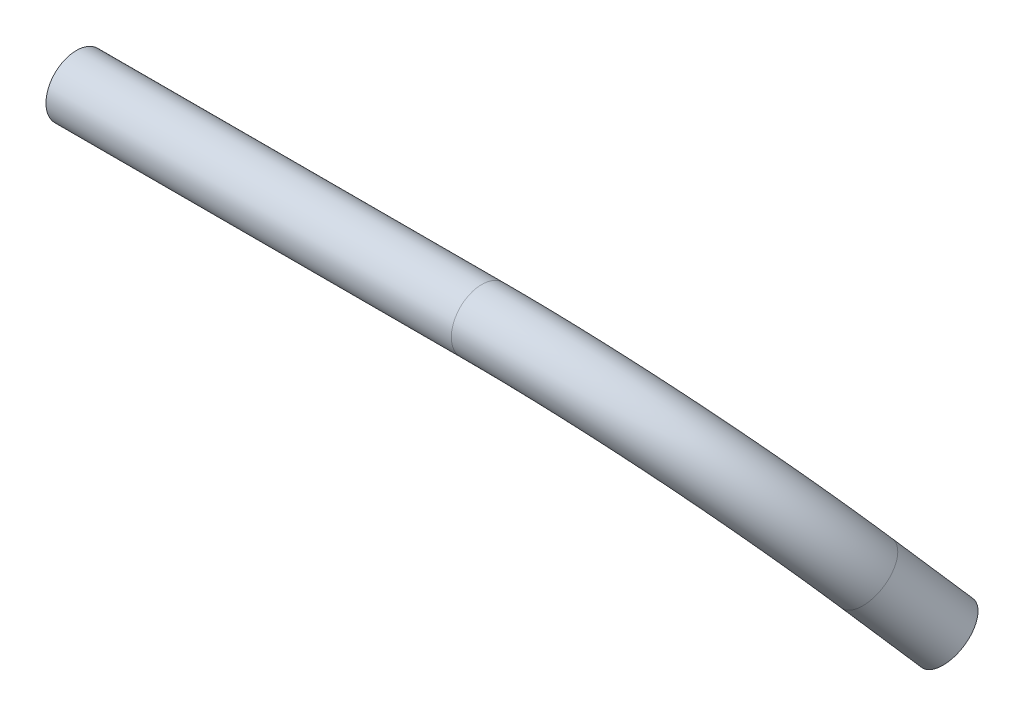
ISO-10303-21;
HEADER;
FILE_DESCRIPTION(('STEP AP214'),'2;1');
FILE_NAME('part.step','',(''),(''),'','','');
FILE_SCHEMA(('AUTOMOTIVE_DESIGN { 1 0 10303 214 1 1 1 1 }'));
ENDSEC;
DATA;
#1=APPLICATION_CONTEXT('core data for automotive mechanical design processes');
#2=APPLICATION_PROTOCOL_DEFINITION('international standard','automotive_design',2000,#1);
#3=PRODUCT_CONTEXT('',#1,'mechanical');
#4=PRODUCT('Part','Part','',(#3));
#5=PRODUCT_RELATED_PRODUCT_CATEGORY('part','',(#4));
#6=PRODUCT_DEFINITION_FORMATION('','',#4);
#7=PRODUCT_DEFINITION_CONTEXT('part definition',#1,'design');
#8=PRODUCT_DEFINITION('design','',#6,#7);
#9=PRODUCT_DEFINITION_SHAPE('','',#8);
#10=(LENGTH_UNIT() NAMED_UNIT(*) SI_UNIT(.MILLI.,.METRE.));
#11=(NAMED_UNIT(*) PLANE_ANGLE_UNIT() SI_UNIT($,.RADIAN.));
#12=(NAMED_UNIT(*) SI_UNIT($,.STERADIAN.) SOLID_ANGLE_UNIT());
#13=UNCERTAINTY_MEASURE_WITH_UNIT(LENGTH_MEASURE(1.E-05),#10,'distance_accuracy_value','');
#14=(GEOMETRIC_REPRESENTATION_CONTEXT(3) GLOBAL_UNCERTAINTY_ASSIGNED_CONTEXT((#13)) GLOBAL_UNIT_ASSIGNED_CONTEXT((#10,
#11,#12)) REPRESENTATION_CONTEXT('',''));
#15=CARTESIAN_POINT('',(0.,0.,0.));
#16=DIRECTION('',(0.,0.,1.));
#17=DIRECTION('',(1.,0.,0.));
#18=AXIS2_PLACEMENT_3D('',#15,#16,#17);
#19=CARTESIAN_POINT('',(0.,0.,0.));
#20=DIRECTION('',(1.,0.,0.));
#21=DIRECTION('',(0.,0.,-1.));
#22=AXIS2_PLACEMENT_3D('',#19,#20,#21);
#23=PLANE('',#22);
#24=CARTESIAN_POINT('',(0.,0.,0.));
#25=DIRECTION('',(1.,0.,0.));
#26=DIRECTION('',(0.,0.,-1.));
#27=AXIS2_PLACEMENT_3D('',#24,#25,#26);
#28=CIRCLE('',#27,8.2804);
#29=CARTESIAN_POINT('',(0.,0.,-8.2804));
#30=VERTEX_POINT('',#29);
#31=EDGE_CURVE('E77',#30,#30,#28,.F.);
#32=ORIENTED_EDGE('',*,*,#31,.F.);
#33=EDGE_LOOP('',(#32));
#34=FACE_BOUND('',#33,.T.);
#35=CARTESIAN_POINT('',(0.,0.,0.));
#36=DIRECTION('',(1.,0.,0.));
#37=DIRECTION('',(0.,0.,-1.));
#38=AXIS2_PLACEMENT_3D('',#35,#36,#37);
#39=CIRCLE('',#38,9.525);
#40=CARTESIAN_POINT('',(0.,0.,-9.525));
#41=VERTEX_POINT('',#40);
#42=EDGE_CURVE('E11',#41,#41,#39,.T.);
#43=ORIENTED_EDGE('',*,*,#42,.F.);
#44=EDGE_LOOP('',(#43));
#45=FACE_BOUND('',#44,.T.);
#46=ADVANCED_FACE('F71',(#34,#45),#23,.F.);
#47=CARTESIAN_POINT('',(0.,0.,0.));
#48=DIRECTION('',(1.,0.,0.));
#49=DIRECTION('',(0.,0.,-1.));
#50=AXIS2_PLACEMENT_3D('',#47,#48,#49);
#51=CYLINDRICAL_SURFACE('',#50,9.525);
#52=ORIENTED_EDGE('',*,*,#42,.T.);
#53=EDGE_LOOP('',(#52));
#54=FACE_BOUND('',#53,.T.);
#55=CARTESIAN_POINT('',(127.,0.,0.));
#56=DIRECTION('',(-1.,0.,0.));
#57=DIRECTION('',(0.,-0.625405998150787,0.780299517798786));
#58=AXIS2_PLACEMENT_3D('',#55,#56,#57);
#59=CIRCLE('',#58,9.525);
#60=CARTESIAN_POINT('',(127.,7.43235290703344,5.95699213238624));
#61=VERTEX_POINT('',#60);
#62=EDGE_CURVE('E90',#61,#61,#59,.T.);
#63=ORIENTED_EDGE('',*,*,#62,.T.);
#64=EDGE_LOOP('',(#63));
#65=FACE_BOUND('',#64,.T.);
#66=ADVANCED_FACE('F121',(#54,#65),#51,.T.);
#67=CARTESIAN_POINT('',(-1.016,0.,0.));
#68=DIRECTION('',(1.,0.,0.));
#69=DIRECTION('',(0.,0.,-1.));
#70=AXIS2_PLACEMENT_3D('',#67,#68,#69);
#71=CYLINDRICAL_SURFACE('',#70,8.2804);
#72=ORIENTED_EDGE('',*,*,#31,.T.);
#73=EDGE_LOOP('',(#72));
#74=FACE_BOUND('',#73,.T.);
#75=CARTESIAN_POINT('',(127.,0.,0.));
#76=DIRECTION('',(-1.,0.,0.));
#77=DIRECTION('',(0.,-0.625405998150787,0.780299517798786));
#78=AXIS2_PLACEMENT_3D('',#75,#76,#77);
#79=CIRCLE('',#78,8.2804);
#80=CARTESIAN_POINT('',(127.,6.46119212718102,5.17861182708771));
#81=VERTEX_POINT('',#80);
#82=EDGE_CURVE('E94',#81,#81,#79,.T.);
#83=ORIENTED_EDGE('',*,*,#82,.F.);
#84=EDGE_LOOP('',(#83));
#85=FACE_BOUND('',#84,.T.);
#86=ADVANCED_FACE('F119',(#74,#85),#71,.F.);
#87=CARTESIAN_POINT('',(224.060320563455,-60.8757132499259,-48.7915670070022));
#88=DIRECTION('',(-0.422618261740695,0.707191529201985,0.566810326183488));
#89=DIRECTION('',(0.,-0.625405998150786,0.780299517798787));
#90=AXIS2_PLACEMENT_3D('',#87,#88,#89);
#91=PLANE('',#90);
#92=CARTESIAN_POINT('',(224.060320563455,-60.875713249926,-48.7915670070021));
#93=DIRECTION('',(-0.422618261740695,0.707191529201985,0.566810326183488));
#94=DIRECTION('',(0.,-0.625405998150786,0.780299517798787));
#95=AXIS2_PLACEMENT_3D('',#92,#93,#94);
#96=CIRCLE('',#95,8.2804);
#97=CARTESIAN_POINT('',(224.060320563455,-66.0543250770138,-42.330374879821));
#98=VERTEX_POINT('',#97);
#99=EDGE_CURVE('E93',#98,#98,#96,.T.);
#100=ORIENTED_EDGE('',*,*,#99,.T.);
#101=EDGE_LOOP('',(#100));
#102=FACE_BOUND('',#101,.T.);
#103=CARTESIAN_POINT('',(224.060320563455,-60.8757132499259,-48.7915670070022));
#104=DIRECTION('',(-0.422618261740695,0.707191529201985,0.566810326183488));
#105=DIRECTION('',(0.,-0.625405998150786,0.780299517798787));
#106=AXIS2_PLACEMENT_3D('',#103,#104,#105);
#107=CIRCLE('',#106,9.525);
#108=CARTESIAN_POINT('',(224.060320563455,-66.8327053823122,-41.3592140999688));
#109=VERTEX_POINT('',#108);
#110=EDGE_CURVE('E81',#109,#109,#107,.T.);
#111=ORIENTED_EDGE('',*,*,#110,.F.);
#112=EDGE_LOOP('',(#111));
#113=FACE_BOUND('',#112,.T.);
#114=ADVANCED_FACE('F103',(#102,#113),#91,.F.);
#115=CARTESIAN_POINT('',(127.,-74.3235290703344,-59.5699213238625));
#116=DIRECTION('',(0.,0.625405998150787,-0.780299517798786));
#117=DIRECTION('',(0.,0.780299517798786,0.625405998150787));
#118=AXIS2_PLACEMENT_3D('',#115,#116,#117);
#119=TOROIDAL_SURFACE('',#118,95.25,9.525);
#120=CARTESIAN_POINT('',(213.325816715241,-42.9130484081957,-34.3945847219415));
#121=DIRECTION('',(-0.422618261740695,0.707191529201985,0.566810326183488));
#122=DIRECTION('',(0.,-0.625405998150786,0.780299517798787));
#123=AXIS2_PLACEMENT_3D('',#120,#121,#122);
#124=CIRCLE('',#123,9.525);
#125=CARTESIAN_POINT('',(221.958398386765,-39.7720003419818,-31.8770510617494));
#126=VERTEX_POINT('',#125);
#127=EDGE_CURVE('E85',#126,#126,#124,.T.);
#128=CARTESIAN_POINT('',(127.,-74.3235290703344,-59.5699213238625));
#129=DIRECTION('',(0.,0.625405998150787,-0.780299517798786));
#130=DIRECTION('',(0.,0.780299517798786,0.625405998150787));
#131=AXIS2_PLACEMENT_3D('',#128,#129,#130);
#132=CIRCLE('',#131,104.775);
#133=EDGE_CURVE('',#61,#126,#132,.T.);
#134=ORIENTED_EDGE('',*,*,#62,.F.);
#135=ORIENTED_EDGE('',*,*,#127,.T.);
#136=ORIENTED_EDGE('',*,*,#133,.T.);
#137=ORIENTED_EDGE('',*,*,#133,.F.);
#138=EDGE_LOOP('',(#134,#136,#135,#137));
#139=FACE_BOUND('',#138,.T.);
#140=ADVANCED_FACE('F127',(#139),#119,.T.);
#141=CARTESIAN_POINT('',(213.325816715241,-42.9130484081955,-34.3945847219416));
#142=DIRECTION('',(0.422618261740697,-0.707191529201985,-0.566810326183487));
#143=DIRECTION('',(0.,0.625405998150786,-0.780299517798787));
#144=AXIS2_PLACEMENT_3D('',#141,#142,#143);
#145=CYLINDRICAL_SURFACE('',#144,9.525);
#146=ORIENTED_EDGE('',*,*,#110,.T.);
#147=EDGE_LOOP('',(#146));
#148=FACE_BOUND('',#147,.T.);
#149=ORIENTED_EDGE('',*,*,#127,.F.);
#150=EDGE_LOOP('',(#149));
#151=FACE_BOUND('',#150,.T.);
#152=ADVANCED_FACE('F115',(#148,#151),#145,.T.);
#153=CARTESIAN_POINT('',(127.,-74.3235290703344,-59.5699213238625));
#154=DIRECTION('',(0.,0.625405998150787,-0.780299517798786));
#155=DIRECTION('',(0.,0.780299517798786,0.625405998150787));
#156=AXIS2_PLACEMENT_3D('',#153,#154,#155);
#157=TOROIDAL_SURFACE('',#156,95.25,8.2804);
#158=CARTESIAN_POINT('',(213.325816715241,-42.9130484081954,-34.3945847219413));
#159=DIRECTION('',(-0.422618261740695,0.707191529201985,0.566810326183488));
#160=DIRECTION('',(0.,-0.625405998150786,0.780299517798787));
#161=AXIS2_PLACEMENT_3D('',#158,#159,#160);
#162=CIRCLE('',#161,8.2804);
#163=CARTESIAN_POINT('',(220.830407715019,-40.1824306226336,-32.2060087933477));
#164=VERTEX_POINT('',#163);
#165=EDGE_CURVE('E97',#164,#164,#162,.T.);
#166=CARTESIAN_POINT('',(127.,-74.3235290703344,-59.5699213238625));
#167=DIRECTION('',(0.,0.625405998150787,-0.780299517798786));
#168=DIRECTION('',(0.,0.780299517798786,0.625405998150787));
#169=AXIS2_PLACEMENT_3D('',#166,#167,#168);
#170=CIRCLE('',#169,103.5304);
#171=EDGE_CURVE('',#81,#164,#170,.T.);
#172=ORIENTED_EDGE('',*,*,#82,.T.);
#173=ORIENTED_EDGE('',*,*,#165,.F.);
#174=ORIENTED_EDGE('',*,*,#171,.T.);
#175=ORIENTED_EDGE('',*,*,#171,.F.);
#176=EDGE_LOOP('',(#172,#174,#173,#175));
#177=FACE_BOUND('',#176,.T.);
#178=ADVANCED_FACE('F109',(#177),#157,.F.);
#179=CARTESIAN_POINT('',(213.325816715241,-42.9130484081956,-34.3945847219415));
#180=DIRECTION('',(0.422618261740697,-0.707191529201985,-0.566810326183487));
#181=DIRECTION('',(0.,0.625405998150786,-0.780299517798787));
#182=AXIS2_PLACEMENT_3D('',#179,#180,#181);
#183=CYLINDRICAL_SURFACE('',#182,8.2804);
#184=ORIENTED_EDGE('',*,*,#99,.F.);
#185=EDGE_LOOP('',(#184));
#186=FACE_BOUND('',#185,.T.);
#187=ORIENTED_EDGE('',*,*,#165,.T.);
#188=EDGE_LOOP('',(#187));
#189=FACE_BOUND('',#188,.T.);
#190=ADVANCED_FACE('F106',(#186,#189),#183,.F.);
#191=CLOSED_SHELL('',(#46,#66,#86,#114,#140,#152,#178,#190));
#192=MANIFOLD_SOLID_BREP('B2',#191);
#193=ADVANCED_BREP_SHAPE_REPRESENTATION('',(#18,#192),#14);
#194=SHAPE_DEFINITION_REPRESENTATION(#9,#193);
ENDSEC;
END-ISO-10303-21;
